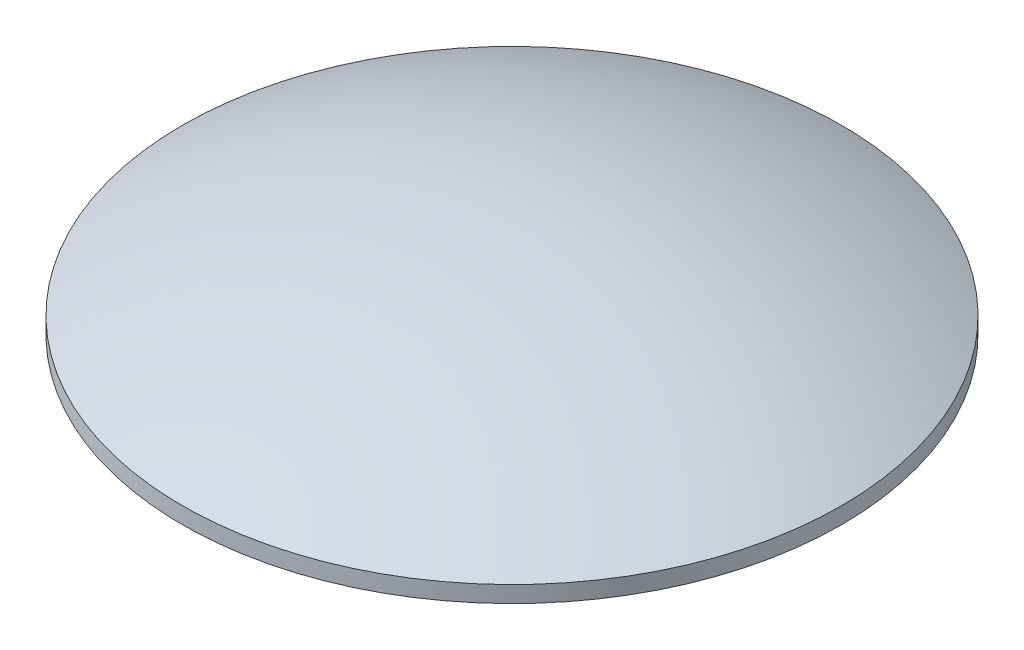
ISO-10303-21;
HEADER;
FILE_DESCRIPTION(('STEP AP214'),'2;1');
FILE_NAME('part.step','',(''),(''),'','','');
FILE_SCHEMA(('AUTOMOTIVE_DESIGN { 1 0 10303 214 1 1 1 1 }'));
ENDSEC;
DATA;
#1=APPLICATION_CONTEXT('core data for automotive mechanical design processes');
#2=APPLICATION_PROTOCOL_DEFINITION('international standard','automotive_design',2000,#1);
#3=PRODUCT_CONTEXT('',#1,'mechanical');
#4=PRODUCT('Part','Part','',(#3));
#5=PRODUCT_RELATED_PRODUCT_CATEGORY('part','',(#4));
#6=PRODUCT_DEFINITION_FORMATION('','',#4);
#7=PRODUCT_DEFINITION_CONTEXT('part definition',#1,'design');
#8=PRODUCT_DEFINITION('design','',#6,#7);
#9=PRODUCT_DEFINITION_SHAPE('','',#8);
#10=(LENGTH_UNIT() NAMED_UNIT(*) SI_UNIT(.MILLI.,.METRE.));
#11=(NAMED_UNIT(*) PLANE_ANGLE_UNIT() SI_UNIT($,.RADIAN.));
#12=(NAMED_UNIT(*) SI_UNIT($,.STERADIAN.) SOLID_ANGLE_UNIT());
#13=UNCERTAINTY_MEASURE_WITH_UNIT(LENGTH_MEASURE(1.E-05),#10,'distance_accuracy_value','');
#14=(GEOMETRIC_REPRESENTATION_CONTEXT(3) GLOBAL_UNCERTAINTY_ASSIGNED_CONTEXT((#13)) GLOBAL_UNIT_ASSIGNED_CONTEXT((#10,
#11,#12)) REPRESENTATION_CONTEXT('',''));
#15=CARTESIAN_POINT('',(0.,0.,0.));
#16=DIRECTION('',(0.,0.,1.));
#17=DIRECTION('',(1.,0.,0.));
#18=AXIS2_PLACEMENT_3D('',#15,#16,#17);
#19=CARTESIAN_POINT('',(0.,2.,3.77638883463117));
#20=DIRECTION('',(0.,-1.,0.));
#21=DIRECTION('',(1.,0.,0.));
#22=AXIS2_PLACEMENT_3D('',#19,#20,#21);
#23=CYLINDRICAL_SURFACE('',#22,14.);
#24=CARTESIAN_POINT('',(0.,2.,3.77638883463117));
#25=DIRECTION('',(0.,1.,0.));
#26=DIRECTION('',(-1.,0.,0.));
#27=AXIS2_PLACEMENT_3D('',#24,#25,#26);
#28=CIRCLE('',#27,14.);
#29=CARTESIAN_POINT('',(-14.,2.00000000000001,3.77638883463117));
#30=VERTEX_POINT('',#29);
#31=EDGE_CURVE('E11',#30,#30,#28,.T.);
#32=ORIENTED_EDGE('',*,*,#31,.F.);
#33=EDGE_LOOP('',(#32));
#34=FACE_BOUND('',#33,.T.);
#35=CARTESIAN_POINT('',(0.,1.,3.77638883463117));
#36=DIRECTION('',(0.,1.,0.));
#37=DIRECTION('',(-1.,0.,0.));
#38=AXIS2_PLACEMENT_3D('',#35,#36,#37);
#39=CIRCLE('',#38,14.);
#40=CARTESIAN_POINT('',(-14.,1.00000000000001,3.77638883463117));
#41=VERTEX_POINT('',#40);
#42=EDGE_CURVE('E54',#41,#41,#39,.T.);
#43=ORIENTED_EDGE('',*,*,#42,.T.);
#44=EDGE_LOOP('',(#43));
#45=FACE_BOUND('',#44,.T.);
#46=ADVANCED_FACE('F51',(#34,#45),#23,.T.);
#47=CARTESIAN_POINT('',(0.,2.,3.77638883463117));
#48=DIRECTION('',(0.,1.,0.));
#49=DIRECTION('',(-1.,0.,0.));
#50=AXIS2_PLACEMENT_3D('',#47,#48,#49);
#51=PLANE('',#50);
#52=ORIENTED_EDGE('',*,*,#31,.T.);
#53=EDGE_LOOP('',(#52));
#54=FACE_BOUND('',#53,.T.);
#55=ADVANCED_FACE('F66',(#54),#51,.T.);
#56=CARTESIAN_POINT('',(0.,1.,3.77638883463117));
#57=DIRECTION('',(0.,1.,0.));
#58=DIRECTION('',(-1.,0.,0.));
#59=AXIS2_PLACEMENT_3D('',#56,#57,#58);
#60=PLANE('',#59);
#61=ORIENTED_EDGE('',*,*,#42,.F.);
#62=EDGE_LOOP('',(#61));
#63=FACE_BOUND('',#62,.T.);
#64=ADVANCED_FACE('F64',(#63),#60,.F.);
#65=CLOSED_SHELL('',(#46,#55,#64));
#66=MANIFOLD_SOLID_BREP('B2',#65);
#67=CARTESIAN_POINT('',(0.,0.,0.));
#68=DIRECTION('',(0.,1.,0.));
#69=DIRECTION('',(-1.,0.,0.));
#70=AXIS2_PLACEMENT_3D('',#67,#68,#69);
#71=PLANE('',#70);
#72=CARTESIAN_POINT('',(0.,0.,0.));
#73=DIRECTION('',(0.,1.,0.));
#74=DIRECTION('',(-1.,0.,0.));
#75=AXIS2_PLACEMENT_3D('',#72,#73,#74);
#76=CIRCLE('',#75,20.);
#77=CARTESIAN_POINT('',(-20.,0.,0.));
#78=VERTEX_POINT('',#77);
#79=EDGE_CURVE('E108',#78,#78,#76,.T.);
#80=ORIENTED_EDGE('',*,*,#79,.F.);
#81=EDGE_LOOP('',(#80));
#82=FACE_BOUND('',#81,.T.);
#83=ADVANCED_FACE('F99',(#82),#71,.F.);
#84=CARTESIAN_POINT('',(0.,1.,0.));
#85=DIRECTION('',(0.,1.,0.));
#86=DIRECTION('',(-1.,0.,0.));
#87=AXIS2_PLACEMENT_3D('',#84,#85,#86);
#88=CYLINDRICAL_SURFACE('',#87,20.);
#89=CARTESIAN_POINT('',(0.,1.00000000000001,0.));
#90=DIRECTION('',(0.,1.,0.));
#91=DIRECTION('',(-1.,0.,0.));
#92=AXIS2_PLACEMENT_3D('',#89,#90,#91);
#93=CIRCLE('',#92,20.);
#94=CARTESIAN_POINT('',(-20.,1.00000000000001,0.));
#95=VERTEX_POINT('',#94);
#96=EDGE_CURVE('E113',#95,#95,#93,.T.);
#97=ORIENTED_EDGE('',*,*,#96,.F.);
#98=EDGE_LOOP('',(#97));
#99=FACE_BOUND('',#98,.T.);
#100=ORIENTED_EDGE('',*,*,#79,.T.);
#101=EDGE_LOOP('',(#100));
#102=FACE_BOUND('',#101,.T.);
#103=ADVANCED_FACE('F123',(#99,#102),#88,.T.);
#104=CARTESIAN_POINT('',(0.,-36.5,0.));
#105=DIRECTION('',(0.,1.,0.));
#106=DIRECTION('',(-1.,0.,0.));
#107=AXIS2_PLACEMENT_3D('',#104,#105,#106);
#108=SPHERICAL_SURFACE('',#107,42.5);
#109=ORIENTED_EDGE('',*,*,#96,.T.);
#110=EDGE_LOOP('',(#109));
#111=FACE_BOUND('',#110,.T.);
#112=ADVANCED_FACE('F121',(#111),#108,.T.);
#113=CLOSED_SHELL('',(#83,#103,#112));
#114=CARTESIAN_POINT('',(0.,-36.5,0.));
#115=DIRECTION('',(0.,1.,0.));
#116=DIRECTION('',(-1.,0.,0.));
#117=AXIS2_PLACEMENT_3D('',#114,#115,#116);
#118=SPHERICAL_SURFACE('',#117,41.5);
#119=CARTESIAN_POINT('',(0.,1.00000000000001,0.));
#120=DIRECTION('',(0.,1.,0.));
#121=DIRECTION('',(-1.,0.,0.));
#122=AXIS2_PLACEMENT_3D('',#119,#120,#121);
#123=CIRCLE('',#122,17.7763888346312);
#124=CARTESIAN_POINT('',(-17.7763888346312,1.00000000000001,0.));
#125=VERTEX_POINT('',#124);
#126=EDGE_CURVE('E50',#125,#125,#123,.T.);
#127=ORIENTED_EDGE('',*,*,#126,.F.);
#128=EDGE_LOOP('',(#127));
#129=FACE_BOUND('',#128,.T.);
#130=ADVANCED_FACE('F101',(#129),#118,.F.);
#131=CARTESIAN_POINT('',(0.,1.,0.));
#132=DIRECTION('',(0.,-1.,0.));
#133=DIRECTION('',(1.,0.,0.));
#134=AXIS2_PLACEMENT_3D('',#131,#132,#133);
#135=PLANE('',#134);
#136=ORIENTED_EDGE('',*,*,#126,.T.);
#137=EDGE_LOOP('',(#136));
#138=FACE_BOUND('',#137,.T.);
#139=ADVANCED_FACE('F133',(#138),#135,.F.);
#140=CLOSED_SHELL('',(#130,#139));
#141=ORIENTED_CLOSED_SHELL('',*,#140,.T.);
#142=BREP_WITH_VOIDS('B6',#113,(#141));
#143=ADVANCED_BREP_SHAPE_REPRESENTATION('',(#18,#66,#142),#14);
#144=SHAPE_DEFINITION_REPRESENTATION(#9,#143);
ENDSEC;
END-ISO-10303-21;
